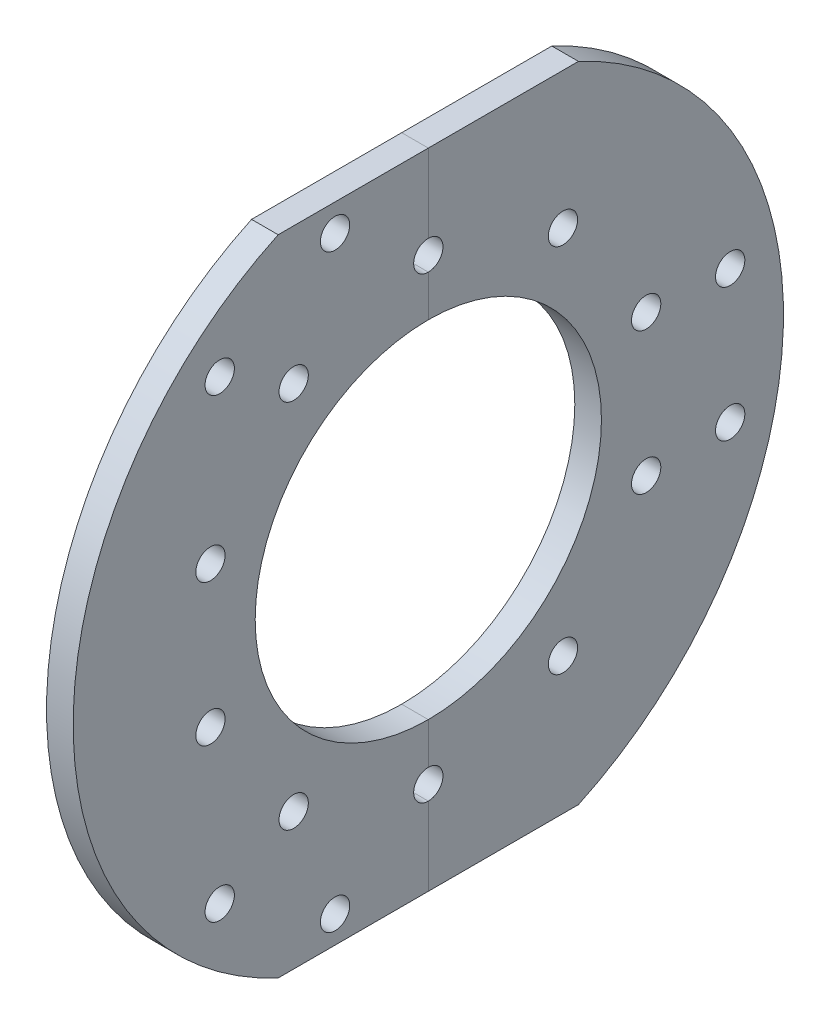
ISO-10303-21;
HEADER;
FILE_DESCRIPTION(('STEP AP214'),'2;1');
FILE_NAME('part.step','',(''),(''),'','','');
FILE_SCHEMA(('AUTOMOTIVE_DESIGN { 1 0 10303 214 1 1 1 1 }'));
ENDSEC;
DATA;
#1=APPLICATION_CONTEXT('core data for automotive mechanical design processes');
#2=APPLICATION_PROTOCOL_DEFINITION('international standard','automotive_design',2000,#1);
#3=PRODUCT_CONTEXT('',#1,'mechanical');
#4=PRODUCT('Part','Part','',(#3));
#5=PRODUCT_RELATED_PRODUCT_CATEGORY('part','',(#4));
#6=PRODUCT_DEFINITION_FORMATION('','',#4);
#7=PRODUCT_DEFINITION_CONTEXT('part definition',#1,'design');
#8=PRODUCT_DEFINITION('design','',#6,#7);
#9=PRODUCT_DEFINITION_SHAPE('','',#8);
#10=(LENGTH_UNIT() NAMED_UNIT(*) SI_UNIT(.MILLI.,.METRE.));
#11=(NAMED_UNIT(*) PLANE_ANGLE_UNIT() SI_UNIT($,.RADIAN.));
#12=(NAMED_UNIT(*) SI_UNIT($,.STERADIAN.) SOLID_ANGLE_UNIT());
#13=UNCERTAINTY_MEASURE_WITH_UNIT(LENGTH_MEASURE(1.E-05),#10,'distance_accuracy_value','');
#14=(GEOMETRIC_REPRESENTATION_CONTEXT(3) GLOBAL_UNCERTAINTY_ASSIGNED_CONTEXT((#13)) GLOBAL_UNIT_ASSIGNED_CONTEXT((#10,
#11,#12)) REPRESENTATION_CONTEXT('',''));
#15=CARTESIAN_POINT('',(0.,0.,0.));
#16=DIRECTION('',(0.,0.,1.));
#17=DIRECTION('',(1.,0.,0.));
#18=AXIS2_PLACEMENT_3D('',#15,#16,#17);
#19=CARTESIAN_POINT('',(0.,0.,0.));
#20=DIRECTION('',(0.,0.,1.));
#21=DIRECTION('',(1.,0.,0.));
#22=AXIS2_PLACEMENT_3D('',#19,#20,#21);
#23=PLANE('',#22);
#24=DIRECTION('',(0.,-1.,0.));
#25=VECTOR('',#24,1.);
#26=CARTESIAN_POINT('',(6.,0.,0.));
#27=LINE('',#26,#25);
#28=CARTESIAN_POINT('',(6.,72.5,0.));
#29=VERTEX_POINT('',#28);
#30=CARTESIAN_POINT('',(6.,54.9,0.));
#31=VERTEX_POINT('',#30);
#32=EDGE_CURVE('E94',#29,#31,#27,.T.);
#33=ORIENTED_EDGE('',*,*,#32,.F.);
#34=DIRECTION('',(1.,0.,0.));
#35=VECTOR('',#34,1.);
#36=CARTESIAN_POINT('',(6.,72.5,0.));
#37=LINE('',#36,#35);
#38=CARTESIAN_POINT('',(0.,72.5,0.));
#39=VERTEX_POINT('',#38);
#40=EDGE_CURVE('E160',#39,#29,#37,.T.);
#41=ORIENTED_EDGE('',*,*,#40,.F.);
#42=DIRECTION('',(0.,-1.,0.));
#43=VECTOR('',#42,1.);
#44=CARTESIAN_POINT('',(0.,0.,0.));
#45=LINE('',#44,#43);
#46=CARTESIAN_POINT('',(0.,54.9,0.));
#47=VERTEX_POINT('',#46);
#48=EDGE_CURVE('E144',#39,#47,#45,.T.);
#49=ORIENTED_EDGE('',*,*,#48,.T.);
#50=DIRECTION('',(-1.,0.,0.));
#51=VECTOR('',#50,1.);
#52=CARTESIAN_POINT('',(6.,54.9,0.));
#53=LINE('',#52,#51);
#54=EDGE_CURVE('E152',#31,#47,#53,.T.);
#55=ORIENTED_EDGE('',*,*,#54,.F.);
#56=EDGE_LOOP('',(#33,#41,#49,#55));
#57=FACE_BOUND('',#56,.T.);
#58=ADVANCED_FACE('F55',(#57),#23,.T.);
#59=CARTESIAN_POINT('',(6.,48.3,0.));
#60=VERTEX_POINT('',#59);
#61=CARTESIAN_POINT('',(6.,39.,0.));
#62=VERTEX_POINT('',#61);
#63=EDGE_CURVE('E226',#60,#62,#27,.T.);
#64=ORIENTED_EDGE('',*,*,#63,.F.);
#65=DIRECTION('',(-1.,0.,0.));
#66=VECTOR('',#65,1.);
#67=CARTESIAN_POINT('',(6.,48.3,0.));
#68=LINE('',#67,#66);
#69=CARTESIAN_POINT('',(0.,48.3,0.));
#70=VERTEX_POINT('',#69);
#71=EDGE_CURVE('E156',#70,#60,#68,.F.);
#72=ORIENTED_EDGE('',*,*,#71,.F.);
#73=CARTESIAN_POINT('',(0.,39.,0.));
#74=VERTEX_POINT('',#73);
#75=EDGE_CURVE('E146',#70,#74,#45,.T.);
#76=ORIENTED_EDGE('',*,*,#75,.T.);
#77=DIRECTION('',(-1.,0.,0.));
#78=VECTOR('',#77,1.);
#79=CARTESIAN_POINT('',(6.,39.,0.));
#80=LINE('',#79,#78);
#81=EDGE_CURVE('E194',#62,#74,#80,.T.);
#82=ORIENTED_EDGE('',*,*,#81,.F.);
#83=EDGE_LOOP('',(#64,#72,#76,#82));
#84=FACE_BOUND('',#83,.T.);
#85=ADVANCED_FACE('F342',(#84),#23,.T.);
#86=CARTESIAN_POINT('',(6.,-39.,0.));
#87=VERTEX_POINT('',#86);
#88=CARTESIAN_POINT('',(6.,-48.3,0.));
#89=VERTEX_POINT('',#88);
#90=EDGE_CURVE('E340',#87,#89,#27,.T.);
#91=ORIENTED_EDGE('',*,*,#90,.F.);
#92=DIRECTION('',(-1.,0.,0.));
#93=VECTOR('',#92,1.);
#94=CARTESIAN_POINT('',(6.,-39.,0.));
#95=LINE('',#94,#93);
#96=CARTESIAN_POINT('',(0.,-39.,0.));
#97=VERTEX_POINT('',#96);
#98=EDGE_CURVE('E182',#97,#87,#95,.F.);
#99=ORIENTED_EDGE('',*,*,#98,.F.);
#100=CARTESIAN_POINT('',(0.,-48.3,0.));
#101=VERTEX_POINT('',#100);
#102=EDGE_CURVE('E166',#97,#101,#45,.T.);
#103=ORIENTED_EDGE('',*,*,#102,.T.);
#104=DIRECTION('',(-1.,0.,0.));
#105=VECTOR('',#104,1.);
#106=CARTESIAN_POINT('',(6.,-48.3,0.));
#107=LINE('',#106,#105);
#108=EDGE_CURVE('E179',#89,#101,#107,.T.);
#109=ORIENTED_EDGE('',*,*,#108,.F.);
#110=EDGE_LOOP('',(#91,#99,#103,#109));
#111=FACE_BOUND('',#110,.T.);
#112=ADVANCED_FACE('F177',(#111),#23,.T.);
#113=CARTESIAN_POINT('',(6.,-54.9,0.));
#114=VERTEX_POINT('',#113);
#115=CARTESIAN_POINT('',(6.,-72.5,0.));
#116=VERTEX_POINT('',#115);
#117=EDGE_CURVE('E227',#114,#116,#27,.T.);
#118=ORIENTED_EDGE('',*,*,#117,.F.);
#119=DIRECTION('',(-1.,0.,0.));
#120=VECTOR('',#119,1.);
#121=CARTESIAN_POINT('',(6.,-54.9,0.));
#122=LINE('',#121,#120);
#123=CARTESIAN_POINT('',(0.,-54.9,0.));
#124=VERTEX_POINT('',#123);
#125=EDGE_CURVE('E157',#124,#114,#122,.F.);
#126=ORIENTED_EDGE('',*,*,#125,.F.);
#127=CARTESIAN_POINT('',(0.,-72.5,0.));
#128=VERTEX_POINT('',#127);
#129=EDGE_CURVE('E163',#124,#128,#45,.T.);
#130=ORIENTED_EDGE('',*,*,#129,.T.);
#131=DIRECTION('',(1.,0.,0.));
#132=VECTOR('',#131,1.);
#133=CARTESIAN_POINT('',(6.,-72.5,0.));
#134=LINE('',#133,#132);
#135=EDGE_CURVE('E161',#128,#116,#134,.T.);
#136=ORIENTED_EDGE('',*,*,#135,.T.);
#137=EDGE_LOOP('',(#118,#126,#130,#136));
#138=FACE_BOUND('',#137,.T.);
#139=ADVANCED_FACE('F314',(#138),#23,.T.);
#140=CARTESIAN_POINT('',(6.,-72.5,0.));
#141=DIRECTION('',(0.,1.,0.));
#142=DIRECTION('',(0.,0.,1.));
#143=AXIS2_PLACEMENT_3D('',#140,#141,#142);
#144=PLANE('',#143);
#145=ORIENTED_EDGE('',*,*,#135,.F.);
#146=DIRECTION('',(0.,0.,-1.));
#147=VECTOR('',#146,1.);
#148=CARTESIAN_POINT('',(0.,-72.5,0.));
#149=LINE('',#148,#147);
#150=CARTESIAN_POINT('',(0.,-72.5,-33.8193731461717));
#151=VERTEX_POINT('',#150);
#152=EDGE_CURVE('E74',#128,#151,#149,.T.);
#153=ORIENTED_EDGE('',*,*,#152,.T.);
#154=DIRECTION('',(-1.,0.,0.));
#155=VECTOR('',#154,1.);
#156=CARTESIAN_POINT('',(6.,-72.5,-33.8193731461717));
#157=LINE('',#156,#155);
#158=CARTESIAN_POINT('',(6.,-72.5,-33.8193731461717));
#159=VERTEX_POINT('',#158);
#160=EDGE_CURVE('E209',#159,#151,#157,.T.);
#161=ORIENTED_EDGE('',*,*,#160,.F.);
#162=DIRECTION('',(0.,0.,-1.));
#163=VECTOR('',#162,1.);
#164=CARTESIAN_POINT('',(6.,-72.5,0.));
#165=LINE('',#164,#163);
#166=EDGE_CURVE('E208',#116,#159,#165,.T.);
#167=ORIENTED_EDGE('',*,*,#166,.F.);
#168=EDGE_LOOP('',(#145,#153,#161,#167));
#169=FACE_BOUND('',#168,.T.);
#170=ADVANCED_FACE('F312',(#169),#144,.F.);
#171=CARTESIAN_POINT('',(6.,72.5,0.));
#172=DIRECTION('',(0.,1.,0.));
#173=DIRECTION('',(0.,0.,1.));
#174=AXIS2_PLACEMENT_3D('',#171,#172,#173);
#175=PLANE('',#174);
#176=DIRECTION('',(0.,0.,-1.));
#177=VECTOR('',#176,1.);
#178=CARTESIAN_POINT('',(0.,72.5,0.));
#179=LINE('',#178,#177);
#180=CARTESIAN_POINT('',(0.,72.5,-33.8193731461717));
#181=VERTEX_POINT('',#180);
#182=EDGE_CURVE('E199',#39,#181,#179,.T.);
#183=ORIENTED_EDGE('',*,*,#182,.F.);
#184=ORIENTED_EDGE('',*,*,#40,.T.);
#185=DIRECTION('',(0.,0.,-1.));
#186=VECTOR('',#185,1.);
#187=CARTESIAN_POINT('',(6.,72.5,0.));
#188=LINE('',#187,#186);
#189=CARTESIAN_POINT('',(6.,72.5,-33.8193731461717));
#190=VERTEX_POINT('',#189);
#191=EDGE_CURVE('E86',#29,#190,#188,.T.);
#192=ORIENTED_EDGE('',*,*,#191,.T.);
#193=DIRECTION('',(-1.,0.,0.));
#194=VECTOR('',#193,1.);
#195=CARTESIAN_POINT('',(6.,72.5,-33.8193731461717));
#196=LINE('',#195,#194);
#197=EDGE_CURVE('E204',#190,#181,#196,.T.);
#198=ORIENTED_EDGE('',*,*,#197,.T.);
#199=EDGE_LOOP('',(#183,#184,#192,#198));
#200=FACE_BOUND('',#199,.T.);
#201=ADVANCED_FACE('F198',(#200),#175,.T.);
#202=CARTESIAN_POINT('',(6.,0.,0.));
#203=DIRECTION('',(-1.,0.,0.));
#204=DIRECTION('',(0.,0.,1.));
#205=AXIS2_PLACEMENT_3D('',#202,#203,#204);
#206=CYLINDRICAL_SURFACE('',#205,39.);
#207=CARTESIAN_POINT('',(6.,0.,0.));
#208=DIRECTION('',(1.,0.,0.));
#209=DIRECTION('',(0.,0.,-1.));
#210=AXIS2_PLACEMENT_3D('',#207,#208,#209);
#211=CIRCLE('',#210,39.);
#212=EDGE_CURVE('E242',#87,#62,#211,.T.);
#213=ORIENTED_EDGE('',*,*,#212,.T.);
#214=ORIENTED_EDGE('',*,*,#81,.T.);
#215=CARTESIAN_POINT('',(0.,0.,0.));
#216=DIRECTION('',(1.,0.,0.));
#217=DIRECTION('',(0.,0.,-1.));
#218=AXIS2_PLACEMENT_3D('',#215,#216,#217);
#219=CIRCLE('',#218,39.);
#220=EDGE_CURVE('E183',#97,#74,#219,.T.);
#221=ORIENTED_EDGE('',*,*,#220,.F.);
#222=ORIENTED_EDGE('',*,*,#98,.T.);
#223=EDGE_LOOP('',(#213,#214,#221,#222));
#224=FACE_BOUND('',#223,.T.);
#225=ADVANCED_FACE('F320',(#224),#206,.F.);
#226=CARTESIAN_POINT('',(6.,-51.6,0.));
#227=DIRECTION('',(-1.,0.,0.));
#228=DIRECTION('',(0.,0.,1.));
#229=AXIS2_PLACEMENT_3D('',#226,#227,#228);
#230=CYLINDRICAL_SURFACE('',#229,3.29999999999999);
#231=CARTESIAN_POINT('',(6.,-51.6,0.));
#232=DIRECTION('',(1.,0.,0.));
#233=DIRECTION('',(0.,0.,-1.));
#234=AXIS2_PLACEMENT_3D('',#231,#232,#233);
#235=CIRCLE('',#234,3.29999999999999);
#236=EDGE_CURVE('E191',#114,#89,#235,.T.);
#237=ORIENTED_EDGE('',*,*,#236,.T.);
#238=ORIENTED_EDGE('',*,*,#108,.T.);
#239=CARTESIAN_POINT('',(0.,-51.6,0.));
#240=DIRECTION('',(1.,0.,0.));
#241=DIRECTION('',(0.,0.,-1.));
#242=AXIS2_PLACEMENT_3D('',#239,#240,#241);
#243=CIRCLE('',#242,3.29999999999999);
#244=EDGE_CURVE('E185',#124,#101,#243,.T.);
#245=ORIENTED_EDGE('',*,*,#244,.F.);
#246=ORIENTED_EDGE('',*,*,#125,.T.);
#247=EDGE_LOOP('',(#237,#238,#245,#246));
#248=FACE_BOUND('',#247,.T.);
#249=ADVANCED_FACE('F189',(#248),#230,.F.);
#250=CARTESIAN_POINT('',(6.,51.6,0.));
#251=DIRECTION('',(-1.,0.,0.));
#252=DIRECTION('',(0.,0.,1.));
#253=AXIS2_PLACEMENT_3D('',#250,#251,#252);
#254=CYLINDRICAL_SURFACE('',#253,3.3);
#255=CARTESIAN_POINT('',(6.,51.6,0.));
#256=DIRECTION('',(1.,0.,0.));
#257=DIRECTION('',(0.,0.,-1.));
#258=AXIS2_PLACEMENT_3D('',#255,#256,#257);
#259=CIRCLE('',#258,3.3);
#260=EDGE_CURVE('E154',#60,#31,#259,.T.);
#261=ORIENTED_EDGE('',*,*,#260,.T.);
#262=ORIENTED_EDGE('',*,*,#54,.T.);
#263=CARTESIAN_POINT('',(0.,51.6,0.));
#264=DIRECTION('',(1.,0.,0.));
#265=DIRECTION('',(0.,0.,-1.));
#266=AXIS2_PLACEMENT_3D('',#263,#264,#265);
#267=CIRCLE('',#266,3.3);
#268=EDGE_CURVE('E59',#70,#47,#267,.T.);
#269=ORIENTED_EDGE('',*,*,#268,.F.);
#270=ORIENTED_EDGE('',*,*,#71,.T.);
#271=EDGE_LOOP('',(#261,#262,#269,#270));
#272=FACE_BOUND('',#271,.T.);
#273=ADVANCED_FACE('F153',(#272),#254,.F.);
#274=CARTESIAN_POINT('',(6.,0.,0.));
#275=DIRECTION('',(1.,0.,0.));
#276=DIRECTION('',(0.,0.,-1.));
#277=AXIS2_PLACEMENT_3D('',#274,#275,#276);
#278=PLANE('',#277);
#279=CARTESIAN_POINT('',(6.,-41.7452769097473,-30.3297190182916));
#280=DIRECTION('',(1.,0.,0.));
#281=DIRECTION('',(0.,0.,-1.));
#282=AXIS2_PLACEMENT_3D('',#279,#280,#281);
#283=CIRCLE('',#282,3.3);
#284=CARTESIAN_POINT('',(6.,-41.7452769097473,-33.6297190182916));
#285=VERTEX_POINT('',#284);
#286=EDGE_CURVE('E241',#285,#285,#283,.T.);
#287=ORIENTED_EDGE('',*,*,#286,.F.);
#288=EDGE_LOOP('',(#287));
#289=FACE_BOUND('',#288,.T.);
#290=CARTESIAN_POINT('',(6.,-15.9452769097473,-49.0745162408299));
#291=DIRECTION('',(1.,0.,0.));
#292=DIRECTION('',(0.,0.,-1.));
#293=AXIS2_PLACEMENT_3D('',#290,#291,#292);
#294=CIRCLE('',#293,3.3);
#295=CARTESIAN_POINT('',(6.,-15.9452769097473,-52.3745162408299));
#296=VERTEX_POINT('',#295);
#297=EDGE_CURVE('E275',#296,#296,#294,.T.);
#298=ORIENTED_EDGE('',*,*,#297,.F.);
#299=EDGE_LOOP('',(#298));
#300=FACE_BOUND('',#299,.T.);
#301=CARTESIAN_POINT('',(6.,15.9452769097473,-49.0745162408299));
#302=DIRECTION('',(1.,0.,0.));
#303=DIRECTION('',(0.,0.,-1.));
#304=AXIS2_PLACEMENT_3D('',#301,#302,#303);
#305=CIRCLE('',#304,3.3);
#306=CARTESIAN_POINT('',(6.,15.9452769097473,-52.3745162408299));
#307=VERTEX_POINT('',#306);
#308=EDGE_CURVE('E283',#307,#307,#305,.T.);
#309=ORIENTED_EDGE('',*,*,#308,.F.);
#310=EDGE_LOOP('',(#309));
#311=FACE_BOUND('',#310,.T.);
#312=CARTESIAN_POINT('',(6.,41.7452769097473,-30.3297190182916));
#313=DIRECTION('',(1.,0.,0.));
#314=DIRECTION('',(0.,0.,-1.));
#315=AXIS2_PLACEMENT_3D('',#312,#313,#314);
#316=CIRCLE('',#315,3.30000000000004);
#317=CARTESIAN_POINT('',(6.,41.7452769097473,-33.6297190182917));
#318=VERTEX_POINT('',#317);
#319=EDGE_CURVE('E248',#318,#318,#316,.T.);
#320=ORIENTED_EDGE('',*,*,#319,.F.);
#321=EDGE_LOOP('',(#320));
#322=FACE_BOUND('',#321,.T.);
#323=CARTESIAN_POINT('',(6.,15.,-68.));
#324=DIRECTION('',(1.,0.,0.));
#325=DIRECTION('',(0.,0.,-1.));
#326=AXIS2_PLACEMENT_3D('',#323,#324,#325);
#327=CIRCLE('',#326,3.30000000000001);
#328=CARTESIAN_POINT('',(6.,15.,-71.3));
#329=VERTEX_POINT('',#328);
#330=EDGE_CURVE('E247',#329,#329,#327,.T.);
#331=ORIENTED_EDGE('',*,*,#330,.F.);
#332=EDGE_LOOP('',(#331));
#333=FACE_BOUND('',#332,.T.);
#334=CARTESIAN_POINT('',(6.,-15.,-68.));
#335=DIRECTION('',(1.,0.,0.));
#336=DIRECTION('',(0.,0.,-1.));
#337=AXIS2_PLACEMENT_3D('',#334,#335,#336);
#338=CIRCLE('',#337,3.3);
#339=CARTESIAN_POINT('',(6.,-15.,-71.3));
#340=VERTEX_POINT('',#339);
#341=EDGE_CURVE('E228',#340,#340,#338,.T.);
#342=ORIENTED_EDGE('',*,*,#341,.F.);
#343=EDGE_LOOP('',(#342));
#344=FACE_BOUND('',#343,.T.);
#345=ORIENTED_EDGE('',*,*,#191,.F.);
#346=ORIENTED_EDGE('',*,*,#32,.T.);
#347=ORIENTED_EDGE('',*,*,#260,.F.);
#348=ORIENTED_EDGE('',*,*,#63,.T.);
#349=ORIENTED_EDGE('',*,*,#212,.F.);
#350=ORIENTED_EDGE('',*,*,#90,.T.);
#351=ORIENTED_EDGE('',*,*,#236,.F.);
#352=ORIENTED_EDGE('',*,*,#117,.T.);
#353=ORIENTED_EDGE('',*,*,#166,.T.);
#354=CARTESIAN_POINT('',(6.,0.,0.));
#355=DIRECTION('',(1.,0.,0.));
#356=DIRECTION('',(0.,0.,-1.));
#357=AXIS2_PLACEMENT_3D('',#354,#355,#356);
#358=CIRCLE('',#357,80.);
#359=EDGE_CURVE('E201',#159,#190,#358,.T.);
#360=ORIENTED_EDGE('',*,*,#359,.T.);
#361=EDGE_LOOP('',(#345,#346,#347,#348,#349,#350,#351,#352,#353,#360));
#362=FACE_BOUND('',#361,.T.);
#363=ADVANCED_FACE('F57',(#289,#300,#311,#322,#333,#344,#362),#278,.T.);
#364=CARTESIAN_POINT('',(0.,0.,0.));
#365=DIRECTION('',(1.,0.,0.));
#366=DIRECTION('',(0.,0.,-1.));
#367=AXIS2_PLACEMENT_3D('',#364,#365,#366);
#368=PLANE('',#367);
#369=CARTESIAN_POINT('',(0.,-41.7452769097473,-30.3297190182916));
#370=DIRECTION('',(1.,0.,0.));
#371=DIRECTION('',(0.,0.,-1.));
#372=AXIS2_PLACEMENT_3D('',#369,#370,#371);
#373=CIRCLE('',#372,3.3);
#374=CARTESIAN_POINT('',(0.,-41.7452769097473,-33.6297190182916));
#375=VERTEX_POINT('',#374);
#376=EDGE_CURVE('E188',#375,#375,#373,.T.);
#377=ORIENTED_EDGE('',*,*,#376,.T.);
#378=EDGE_LOOP('',(#377));
#379=FACE_BOUND('',#378,.T.);
#380=CARTESIAN_POINT('',(0.,-15.9452769097473,-49.0745162408299));
#381=DIRECTION('',(1.,0.,0.));
#382=DIRECTION('',(0.,0.,-1.));
#383=AXIS2_PLACEMENT_3D('',#380,#381,#382);
#384=CIRCLE('',#383,3.3);
#385=CARTESIAN_POINT('',(0.,-15.9452769097473,-52.3745162408299));
#386=VERTEX_POINT('',#385);
#387=EDGE_CURVE('E260',#386,#386,#384,.T.);
#388=ORIENTED_EDGE('',*,*,#387,.T.);
#389=EDGE_LOOP('',(#388));
#390=FACE_BOUND('',#389,.T.);
#391=CARTESIAN_POINT('',(0.,15.9452769097473,-49.0745162408299));
#392=DIRECTION('',(1.,0.,0.));
#393=DIRECTION('',(0.,0.,-1.));
#394=AXIS2_PLACEMENT_3D('',#391,#392,#393);
#395=CIRCLE('',#394,3.3);
#396=CARTESIAN_POINT('',(0.,15.9452769097473,-52.3745162408299));
#397=VERTEX_POINT('',#396);
#398=EDGE_CURVE('E263',#397,#397,#395,.T.);
#399=ORIENTED_EDGE('',*,*,#398,.T.);
#400=EDGE_LOOP('',(#399));
#401=FACE_BOUND('',#400,.T.);
#402=CARTESIAN_POINT('',(0.,41.7452769097473,-30.3297190182916));
#403=DIRECTION('',(1.,0.,0.));
#404=DIRECTION('',(0.,0.,-1.));
#405=AXIS2_PLACEMENT_3D('',#402,#403,#404);
#406=CIRCLE('',#405,3.30000000000004);
#407=CARTESIAN_POINT('',(0.,41.7452769097473,-33.6297190182917));
#408=VERTEX_POINT('',#407);
#409=EDGE_CURVE('E150',#408,#408,#406,.T.);
#410=ORIENTED_EDGE('',*,*,#409,.T.);
#411=EDGE_LOOP('',(#410));
#412=FACE_BOUND('',#411,.T.);
#413=CARTESIAN_POINT('',(0.,15.,-68.));
#414=DIRECTION('',(1.,0.,0.));
#415=DIRECTION('',(0.,0.,-1.));
#416=AXIS2_PLACEMENT_3D('',#413,#414,#415);
#417=CIRCLE('',#416,3.30000000000001);
#418=CARTESIAN_POINT('',(0.,15.,-71.3));
#419=VERTEX_POINT('',#418);
#420=EDGE_CURVE('E65',#419,#419,#417,.T.);
#421=ORIENTED_EDGE('',*,*,#420,.T.);
#422=EDGE_LOOP('',(#421));
#423=FACE_BOUND('',#422,.T.);
#424=CARTESIAN_POINT('',(0.,-15.,-68.));
#425=DIRECTION('',(1.,0.,0.));
#426=DIRECTION('',(0.,0.,-1.));
#427=AXIS2_PLACEMENT_3D('',#424,#425,#426);
#428=CIRCLE('',#427,3.3);
#429=CARTESIAN_POINT('',(0.,-15.,-71.3));
#430=VERTEX_POINT('',#429);
#431=EDGE_CURVE('E13',#430,#430,#428,.T.);
#432=ORIENTED_EDGE('',*,*,#431,.T.);
#433=EDGE_LOOP('',(#432));
#434=FACE_BOUND('',#433,.T.);
#435=ORIENTED_EDGE('',*,*,#48,.F.);
#436=ORIENTED_EDGE('',*,*,#182,.T.);
#437=CARTESIAN_POINT('',(0.,0.,0.));
#438=DIRECTION('',(1.,0.,0.));
#439=DIRECTION('',(0.,0.,-1.));
#440=AXIS2_PLACEMENT_3D('',#437,#438,#439);
#441=CIRCLE('',#440,80.);
#442=EDGE_CURVE('E250',#151,#181,#441,.T.);
#443=ORIENTED_EDGE('',*,*,#442,.F.);
#444=ORIENTED_EDGE('',*,*,#152,.F.);
#445=ORIENTED_EDGE('',*,*,#129,.F.);
#446=ORIENTED_EDGE('',*,*,#244,.T.);
#447=ORIENTED_EDGE('',*,*,#102,.F.);
#448=ORIENTED_EDGE('',*,*,#220,.T.);
#449=ORIENTED_EDGE('',*,*,#75,.F.);
#450=ORIENTED_EDGE('',*,*,#268,.T.);
#451=EDGE_LOOP('',(#435,#436,#443,#444,#445,#446,#447,#448,#449,#450));
#452=FACE_BOUND('',#451,.T.);
#453=ADVANCED_FACE('F142',(#379,#390,#401,#412,#423,#434,#452),#368,.F.);
#454=CARTESIAN_POINT('',(6.,0.,0.));
#455=DIRECTION('',(-1.,0.,0.));
#456=DIRECTION('',(0.,0.,1.));
#457=AXIS2_PLACEMENT_3D('',#454,#455,#456);
#458=CYLINDRICAL_SURFACE('',#457,80.);
#459=ORIENTED_EDGE('',*,*,#442,.T.);
#460=ORIENTED_EDGE('',*,*,#197,.F.);
#461=ORIENTED_EDGE('',*,*,#359,.F.);
#462=ORIENTED_EDGE('',*,*,#160,.T.);
#463=EDGE_LOOP('',(#459,#460,#461,#462));
#464=FACE_BOUND('',#463,.T.);
#465=ADVANCED_FACE('F307',(#464),#458,.T.);
#466=CARTESIAN_POINT('',(6.,-41.7452769097473,-30.3297190182916));
#467=DIRECTION('',(-1.,0.,0.));
#468=DIRECTION('',(0.,0.,1.));
#469=AXIS2_PLACEMENT_3D('',#466,#467,#468);
#470=CYLINDRICAL_SURFACE('',#469,3.3);
#471=ORIENTED_EDGE('',*,*,#286,.T.);
#472=EDGE_LOOP('',(#471));
#473=FACE_BOUND('',#472,.T.);
#474=ORIENTED_EDGE('',*,*,#376,.F.);
#475=EDGE_LOOP('',(#474));
#476=FACE_BOUND('',#475,.T.);
#477=ADVANCED_FACE('F412',(#473,#476),#470,.F.);
#478=CARTESIAN_POINT('',(6.,-15.9452769097473,-49.0745162408299));
#479=DIRECTION('',(-1.,0.,0.));
#480=DIRECTION('',(0.,0.,1.));
#481=AXIS2_PLACEMENT_3D('',#478,#479,#480);
#482=CYLINDRICAL_SURFACE('',#481,3.3);
#483=ORIENTED_EDGE('',*,*,#297,.T.);
#484=EDGE_LOOP('',(#483));
#485=FACE_BOUND('',#484,.T.);
#486=ORIENTED_EDGE('',*,*,#387,.F.);
#487=EDGE_LOOP('',(#486));
#488=FACE_BOUND('',#487,.T.);
#489=ADVANCED_FACE('F420',(#485,#488),#482,.F.);
#490=CARTESIAN_POINT('',(6.,15.9452769097473,-49.0745162408299));
#491=DIRECTION('',(-1.,0.,0.));
#492=DIRECTION('',(0.,0.,1.));
#493=AXIS2_PLACEMENT_3D('',#490,#491,#492);
#494=CYLINDRICAL_SURFACE('',#493,3.3);
#495=ORIENTED_EDGE('',*,*,#308,.T.);
#496=EDGE_LOOP('',(#495));
#497=FACE_BOUND('',#496,.T.);
#498=ORIENTED_EDGE('',*,*,#398,.F.);
#499=EDGE_LOOP('',(#498));
#500=FACE_BOUND('',#499,.T.);
#501=ADVANCED_FACE('F430',(#497,#500),#494,.F.);
#502=CARTESIAN_POINT('',(6.,41.7452769097473,-30.3297190182916));
#503=DIRECTION('',(-1.,0.,0.));
#504=DIRECTION('',(0.,0.,1.));
#505=AXIS2_PLACEMENT_3D('',#502,#503,#504);
#506=CYLINDRICAL_SURFACE('',#505,3.30000000000004);
#507=ORIENTED_EDGE('',*,*,#319,.T.);
#508=EDGE_LOOP('',(#507));
#509=FACE_BOUND('',#508,.T.);
#510=ORIENTED_EDGE('',*,*,#409,.F.);
#511=EDGE_LOOP('',(#510));
#512=FACE_BOUND('',#511,.T.);
#513=ADVANCED_FACE('F440',(#509,#512),#506,.F.);
#514=CARTESIAN_POINT('',(6.,15.,-68.));
#515=DIRECTION('',(-1.,0.,0.));
#516=DIRECTION('',(0.,0.,1.));
#517=AXIS2_PLACEMENT_3D('',#514,#515,#516);
#518=CYLINDRICAL_SURFACE('',#517,3.30000000000001);
#519=ORIENTED_EDGE('',*,*,#330,.T.);
#520=EDGE_LOOP('',(#519));
#521=FACE_BOUND('',#520,.T.);
#522=ORIENTED_EDGE('',*,*,#420,.F.);
#523=EDGE_LOOP('',(#522));
#524=FACE_BOUND('',#523,.T.);
#525=ADVANCED_FACE('F450',(#521,#524),#518,.F.);
#526=CARTESIAN_POINT('',(6.,-15.,-68.));
#527=DIRECTION('',(-1.,0.,0.));
#528=DIRECTION('',(0.,0.,1.));
#529=AXIS2_PLACEMENT_3D('',#526,#527,#528);
#530=CYLINDRICAL_SURFACE('',#529,3.3);
#531=ORIENTED_EDGE('',*,*,#341,.T.);
#532=EDGE_LOOP('',(#531));
#533=FACE_BOUND('',#532,.T.);
#534=ORIENTED_EDGE('',*,*,#431,.F.);
#535=EDGE_LOOP('',(#534));
#536=FACE_BOUND('',#535,.T.);
#537=ADVANCED_FACE('F298',(#533,#536),#530,.F.);
#538=CLOSED_SHELL('',(#58,#85,#112,#139,#170,#201,#225,#249,#273,#363,#453,#465,#477,#489,#501,
#513,#525,#537));
#539=MANIFOLD_SOLID_BREP('B2',#538);
#540=CARTESIAN_POINT('',(0.,0.,0.));
#541=DIRECTION('',(0.,0.,1.));
#542=DIRECTION('',(1.,0.,0.));
#543=AXIS2_PLACEMENT_3D('',#540,#541,#542);
#544=PLANE('',#543);
#545=DIRECTION('',(0.,-1.,0.));
#546=VECTOR('',#545,1.);
#547=CARTESIAN_POINT('',(6.,0.,0.));
#548=LINE('',#547,#546);
#549=CARTESIAN_POINT('',(6.,72.5,0.));
#550=VERTEX_POINT('',#549);
#551=CARTESIAN_POINT('',(6.,54.9,0.));
#552=VERTEX_POINT('',#551);
#553=EDGE_CURVE('E511',#550,#552,#548,.T.);
#554=ORIENTED_EDGE('',*,*,#553,.T.);
#555=DIRECTION('',(-1.,0.,0.));
#556=VECTOR('',#555,1.);
#557=CARTESIAN_POINT('',(6.,54.9,0.));
#558=LINE('',#557,#556);
#559=CARTESIAN_POINT('',(0.,54.9,0.));
#560=VERTEX_POINT('',#559);
#561=EDGE_CURVE('E518',#552,#560,#558,.T.);
#562=ORIENTED_EDGE('',*,*,#561,.T.);
#563=DIRECTION('',(0.,-1.,0.));
#564=VECTOR('',#563,1.);
#565=CARTESIAN_POINT('',(0.,0.,0.));
#566=LINE('',#565,#564);
#567=CARTESIAN_POINT('',(0.,72.5,0.));
#568=VERTEX_POINT('',#567);
#569=EDGE_CURVE('E742',#568,#560,#566,.T.);
#570=ORIENTED_EDGE('',*,*,#569,.F.);
#571=DIRECTION('',(1.,0.,0.));
#572=VECTOR('',#571,1.);
#573=CARTESIAN_POINT('',(6.,72.5,0.));
#574=LINE('',#573,#572);
#575=EDGE_CURVE('E503',#568,#550,#574,.T.);
#576=ORIENTED_EDGE('',*,*,#575,.T.);
#577=EDGE_LOOP('',(#554,#562,#570,#576));
#578=FACE_BOUND('',#577,.T.);
#579=ADVANCED_FACE('F499',(#578),#544,.F.);
#580=CARTESIAN_POINT('',(6.,48.3,0.));
#581=VERTEX_POINT('',#580);
#582=CARTESIAN_POINT('',(6.,39.,0.));
#583=VERTEX_POINT('',#582);
#584=EDGE_CURVE('E758',#581,#583,#548,.T.);
#585=ORIENTED_EDGE('',*,*,#584,.T.);
#586=DIRECTION('',(-1.,0.,0.));
#587=VECTOR('',#586,1.);
#588=CARTESIAN_POINT('',(6.,39.,0.));
#589=LINE('',#588,#587);
#590=CARTESIAN_POINT('',(0.,39.,0.));
#591=VERTEX_POINT('',#590);
#592=EDGE_CURVE('E753',#583,#591,#589,.T.);
#593=ORIENTED_EDGE('',*,*,#592,.T.);
#594=CARTESIAN_POINT('',(0.,48.3,0.));
#595=VERTEX_POINT('',#594);
#596=EDGE_CURVE('E810',#595,#591,#566,.T.);
#597=ORIENTED_EDGE('',*,*,#596,.F.);
#598=DIRECTION('',(-1.,0.,0.));
#599=VECTOR('',#598,1.);
#600=CARTESIAN_POINT('',(6.,48.3,0.));
#601=LINE('',#600,#599);
#602=EDGE_CURVE('E526',#595,#581,#601,.F.);
#603=ORIENTED_EDGE('',*,*,#602,.T.);
#604=EDGE_LOOP('',(#585,#593,#597,#603));
#605=FACE_BOUND('',#604,.T.);
#606=ADVANCED_FACE('F798',(#605),#544,.F.);
#607=CARTESIAN_POINT('',(6.,-39.,0.));
#608=VERTEX_POINT('',#607);
#609=CARTESIAN_POINT('',(6.,-48.3,0.));
#610=VERTEX_POINT('',#609);
#611=EDGE_CURVE('E509',#608,#610,#548,.T.);
#612=ORIENTED_EDGE('',*,*,#611,.T.);
#613=DIRECTION('',(-1.,0.,0.));
#614=VECTOR('',#613,1.);
#615=CARTESIAN_POINT('',(6.,-48.3,0.));
#616=LINE('',#615,#614);
#617=CARTESIAN_POINT('',(0.,-48.3,0.));
#618=VERTEX_POINT('',#617);
#619=EDGE_CURVE('E633',#610,#618,#616,.T.);
#620=ORIENTED_EDGE('',*,*,#619,.T.);
#621=CARTESIAN_POINT('',(0.,-39.,0.));
#622=VERTEX_POINT('',#621);
#623=EDGE_CURVE('E741',#622,#618,#566,.T.);
#624=ORIENTED_EDGE('',*,*,#623,.F.);
#625=DIRECTION('',(-1.,0.,0.));
#626=VECTOR('',#625,1.);
#627=CARTESIAN_POINT('',(6.,-39.,0.));
#628=LINE('',#627,#626);
#629=EDGE_CURVE('E748',#622,#608,#628,.F.);
#630=ORIENTED_EDGE('',*,*,#629,.T.);
#631=EDGE_LOOP('',(#612,#620,#624,#630));
#632=FACE_BOUND('',#631,.T.);
#633=ADVANCED_FACE('F764',(#632),#544,.F.);
#634=CARTESIAN_POINT('',(6.,-54.9,0.));
#635=VERTEX_POINT('',#634);
#636=CARTESIAN_POINT('',(6.,-72.5,0.));
#637=VERTEX_POINT('',#636);
#638=EDGE_CURVE('E53',#635,#637,#548,.T.);
#639=ORIENTED_EDGE('',*,*,#638,.T.);
#640=DIRECTION('',(1.,0.,0.));
#641=VECTOR('',#640,1.);
#642=CARTESIAN_POINT('',(6.,-72.5,0.));
#643=LINE('',#642,#641);
#644=CARTESIAN_POINT('',(0.,-72.5,0.));
#645=VERTEX_POINT('',#644);
#646=EDGE_CURVE('E631',#645,#637,#643,.T.);
#647=ORIENTED_EDGE('',*,*,#646,.F.);
#648=CARTESIAN_POINT('',(0.,-54.9,0.));
#649=VERTEX_POINT('',#648);
#650=EDGE_CURVE('E592',#649,#645,#566,.T.);
#651=ORIENTED_EDGE('',*,*,#650,.F.);
#652=DIRECTION('',(-1.,0.,0.));
#653=VECTOR('',#652,1.);
#654=CARTESIAN_POINT('',(6.,-54.9,0.));
#655=LINE('',#654,#653);
#656=EDGE_CURVE('E743',#649,#635,#655,.F.);
#657=ORIENTED_EDGE('',*,*,#656,.T.);
#658=EDGE_LOOP('',(#639,#647,#651,#657));
#659=FACE_BOUND('',#658,.T.);
#660=ADVANCED_FACE('F501',(#659),#544,.F.);
#661=CARTESIAN_POINT('',(6.,41.7452769097473,30.3297190182916));
#662=DIRECTION('',(-1.,0.,0.));
#663=DIRECTION('',(0.,0.,1.));
#664=AXIS2_PLACEMENT_3D('',#661,#662,#663);
#665=CYLINDRICAL_SURFACE('',#664,3.3);
#666=CARTESIAN_POINT('',(6.,41.7452769097473,30.3297190182916));
#667=DIRECTION('',(1.,0.,0.));
#668=DIRECTION('',(0.,0.,-1.));
#669=AXIS2_PLACEMENT_3D('',#666,#667,#668);
#670=CIRCLE('',#669,3.3);
#671=CARTESIAN_POINT('',(6.,41.7452769097473,27.0297190182916));
#672=VERTEX_POINT('',#671);
#673=EDGE_CURVE('E644',#672,#672,#670,.T.);
#674=ORIENTED_EDGE('',*,*,#673,.T.);
#675=EDGE_LOOP('',(#674));
#676=FACE_BOUND('',#675,.T.);
#677=CARTESIAN_POINT('',(0.,41.7452769097473,30.3297190182916));
#678=DIRECTION('',(1.,0.,0.));
#679=DIRECTION('',(0.,0.,-1.));
#680=AXIS2_PLACEMENT_3D('',#677,#678,#679);
#681=CIRCLE('',#680,3.3);
#682=CARTESIAN_POINT('',(0.,41.7452769097473,27.0297190182916));
#683=VERTEX_POINT('',#682);
#684=EDGE_CURVE('E723',#683,#683,#681,.T.);
#685=ORIENTED_EDGE('',*,*,#684,.F.);
#686=EDGE_LOOP('',(#685));
#687=FACE_BOUND('',#686,.T.);
#688=ADVANCED_FACE('F716',(#676,#687),#665,.F.);
#689=CARTESIAN_POINT('',(6.,15.9452769097473,49.0745162408299));
#690=DIRECTION('',(-1.,0.,0.));
#691=DIRECTION('',(0.,0.,1.));
#692=AXIS2_PLACEMENT_3D('',#689,#690,#691);
#693=CYLINDRICAL_SURFACE('',#692,3.3);
#694=CARTESIAN_POINT('',(6.,15.9452769097473,49.0745162408299));
#695=DIRECTION('',(1.,0.,0.));
#696=DIRECTION('',(0.,0.,-1.));
#697=AXIS2_PLACEMENT_3D('',#694,#695,#696);
#698=CIRCLE('',#697,3.3);
#699=CARTESIAN_POINT('',(6.,15.9452769097473,45.7745162408299));
#700=VERTEX_POINT('',#699);
#701=EDGE_CURVE('E649',#700,#700,#698,.T.);
#702=ORIENTED_EDGE('',*,*,#701,.T.);
#703=EDGE_LOOP('',(#702));
#704=FACE_BOUND('',#703,.T.);
#705=CARTESIAN_POINT('',(0.,15.9452769097473,49.0745162408299));
#706=DIRECTION('',(1.,0.,0.));
#707=DIRECTION('',(0.,0.,-1.));
#708=AXIS2_PLACEMENT_3D('',#705,#706,#707);
#709=CIRCLE('',#708,3.3);
#710=CARTESIAN_POINT('',(0.,15.9452769097473,45.7745162408299));
#711=VERTEX_POINT('',#710);
#712=EDGE_CURVE('E726',#711,#711,#709,.T.);
#713=ORIENTED_EDGE('',*,*,#712,.F.);
#714=EDGE_LOOP('',(#713));
#715=FACE_BOUND('',#714,.T.);
#716=ADVANCED_FACE('F719',(#704,#715),#693,.F.);
#717=CARTESIAN_POINT('',(6.,-15.9452769097473,49.0745162408299));
#718=DIRECTION('',(-1.,0.,0.));
#719=DIRECTION('',(0.,0.,1.));
#720=AXIS2_PLACEMENT_3D('',#717,#718,#719);
#721=CYLINDRICAL_SURFACE('',#720,3.3);
#722=CARTESIAN_POINT('',(6.,-15.9452769097473,49.0745162408299));
#723=DIRECTION('',(1.,0.,0.));
#724=DIRECTION('',(0.,0.,-1.));
#725=AXIS2_PLACEMENT_3D('',#722,#723,#724);
#726=CIRCLE('',#725,3.3);
#727=CARTESIAN_POINT('',(6.,-15.9452769097473,45.7745162408299));
#728=VERTEX_POINT('',#727);
#729=EDGE_CURVE('E654',#728,#728,#726,.T.);
#730=ORIENTED_EDGE('',*,*,#729,.T.);
#731=EDGE_LOOP('',(#730));
#732=FACE_BOUND('',#731,.T.);
#733=CARTESIAN_POINT('',(0.,-15.9452769097473,49.0745162408299));
#734=DIRECTION('',(1.,0.,0.));
#735=DIRECTION('',(0.,0.,-1.));
#736=AXIS2_PLACEMENT_3D('',#733,#734,#735);
#737=CIRCLE('',#736,3.3);
#738=CARTESIAN_POINT('',(0.,-15.9452769097473,45.7745162408299));
#739=VERTEX_POINT('',#738);
#740=EDGE_CURVE('E732',#739,#739,#737,.T.);
#741=ORIENTED_EDGE('',*,*,#740,.F.);
#742=EDGE_LOOP('',(#741));
#743=FACE_BOUND('',#742,.T.);
#744=ADVANCED_FACE('F784',(#732,#743),#721,.F.);
#745=CARTESIAN_POINT('',(6.,-41.7452769097473,30.3297190182916));
#746=DIRECTION('',(-1.,0.,0.));
#747=DIRECTION('',(0.,0.,1.));
#748=AXIS2_PLACEMENT_3D('',#745,#746,#747);
#749=CYLINDRICAL_SURFACE('',#748,3.30000000000001);
#750=CARTESIAN_POINT('',(6.,-41.7452769097473,30.3297190182916));
#751=DIRECTION('',(1.,0.,0.));
#752=DIRECTION('',(0.,0.,-1.));
#753=AXIS2_PLACEMENT_3D('',#750,#751,#752);
#754=CIRCLE('',#753,3.30000000000001);
#755=CARTESIAN_POINT('',(6.,-41.7452769097473,27.0297190182916));
#756=VERTEX_POINT('',#755);
#757=EDGE_CURVE('E662',#756,#756,#754,.T.);
#758=ORIENTED_EDGE('',*,*,#757,.T.);
#759=EDGE_LOOP('',(#758));
#760=FACE_BOUND('',#759,.T.);
#761=CARTESIAN_POINT('',(0.,-41.7452769097473,30.3297190182916));
#762=DIRECTION('',(1.,0.,0.));
#763=DIRECTION('',(0.,0.,-1.));
#764=AXIS2_PLACEMENT_3D('',#761,#762,#763);
#765=CIRCLE('',#764,3.30000000000001);
#766=CARTESIAN_POINT('',(0.,-41.7452769097473,27.0297190182916));
#767=VERTEX_POINT('',#766);
#768=EDGE_CURVE('E770',#767,#767,#765,.T.);
#769=ORIENTED_EDGE('',*,*,#768,.F.);
#770=EDGE_LOOP('',(#769));
#771=FACE_BOUND('',#770,.T.);
#772=ADVANCED_FACE('F786',(#760,#771),#749,.F.);
#773=CARTESIAN_POINT('',(6.,0.,0.));
#774=DIRECTION('',(-1.,0.,0.));
#775=DIRECTION('',(0.,0.,1.));
#776=AXIS2_PLACEMENT_3D('',#773,#774,#775);
#777=CYLINDRICAL_SURFACE('',#776,80.);
#778=CARTESIAN_POINT('',(0.,0.,0.));
#779=DIRECTION('',(1.,0.,0.));
#780=DIRECTION('',(0.,0.,-1.));
#781=AXIS2_PLACEMENT_3D('',#778,#779,#780);
#782=CIRCLE('',#781,80.);
#783=CARTESIAN_POINT('',(0.,72.5,33.8193731461717));
#784=VERTEX_POINT('',#783);
#785=CARTESIAN_POINT('',(0.,-72.5,33.8193731461717));
#786=VERTEX_POINT('',#785);
#787=EDGE_CURVE('E686',#784,#786,#782,.T.);
#788=ORIENTED_EDGE('',*,*,#787,.T.);
#789=DIRECTION('',(-1.,0.,0.));
#790=VECTOR('',#789,1.);
#791=CARTESIAN_POINT('',(6.,-72.5,33.8193731461717));
#792=LINE('',#791,#790);
#793=CARTESIAN_POINT('',(6.,-72.5,33.8193731461717));
#794=VERTEX_POINT('',#793);
#795=EDGE_CURVE('E593',#794,#786,#792,.T.);
#796=ORIENTED_EDGE('',*,*,#795,.F.);
#797=CARTESIAN_POINT('',(6.,0.,0.));
#798=DIRECTION('',(1.,0.,0.));
#799=DIRECTION('',(0.,0.,-1.));
#800=AXIS2_PLACEMENT_3D('',#797,#798,#799);
#801=CIRCLE('',#800,80.);
#802=CARTESIAN_POINT('',(6.,72.5,33.8193731461717));
#803=VERTEX_POINT('',#802);
#804=EDGE_CURVE('E596',#803,#794,#801,.T.);
#805=ORIENTED_EDGE('',*,*,#804,.F.);
#806=DIRECTION('',(-1.,0.,0.));
#807=VECTOR('',#806,1.);
#808=CARTESIAN_POINT('',(6.,72.5,33.8193731461717));
#809=LINE('',#808,#807);
#810=EDGE_CURVE('E583',#803,#784,#809,.T.);
#811=ORIENTED_EDGE('',*,*,#810,.T.);
#812=EDGE_LOOP('',(#788,#796,#805,#811));
#813=FACE_BOUND('',#812,.T.);
#814=ADVANCED_FACE('F597',(#813),#777,.T.);
#815=CARTESIAN_POINT('',(6.,-72.5,0.));
#816=DIRECTION('',(0.,1.,0.));
#817=DIRECTION('',(0.,0.,1.));
#818=AXIS2_PLACEMENT_3D('',#815,#816,#817);
#819=PLANE('',#818);
#820=DIRECTION('',(0.,0.,-1.));
#821=VECTOR('',#820,1.);
#822=CARTESIAN_POINT('',(0.,-72.5,0.));
#823=LINE('',#822,#821);
#824=EDGE_CURVE('E729',#786,#645,#823,.T.);
#825=ORIENTED_EDGE('',*,*,#824,.T.);
#826=ORIENTED_EDGE('',*,*,#646,.T.);
#827=DIRECTION('',(0.,0.,-1.));
#828=VECTOR('',#827,1.);
#829=CARTESIAN_POINT('',(6.,-72.5,0.));
#830=LINE('',#829,#828);
#831=EDGE_CURVE('E609',#794,#637,#830,.T.);
#832=ORIENTED_EDGE('',*,*,#831,.F.);
#833=ORIENTED_EDGE('',*,*,#795,.T.);
#834=EDGE_LOOP('',(#825,#826,#832,#833));
#835=FACE_BOUND('',#834,.T.);
#836=ADVANCED_FACE('F808',(#835),#819,.F.);
#837=CARTESIAN_POINT('',(6.,-51.6,0.));
#838=DIRECTION('',(-1.,0.,0.));
#839=DIRECTION('',(0.,0.,1.));
#840=AXIS2_PLACEMENT_3D('',#837,#838,#839);
#841=CYLINDRICAL_SURFACE('',#840,3.29999999999999);
#842=ORIENTED_EDGE('',*,*,#619,.F.);
#843=CARTESIAN_POINT('',(6.,-51.6,0.));
#844=DIRECTION('',(1.,0.,0.));
#845=DIRECTION('',(0.,0.,-1.));
#846=AXIS2_PLACEMENT_3D('',#843,#844,#845);
#847=CIRCLE('',#846,3.29999999999999);
#848=EDGE_CURVE('E666',#610,#635,#847,.T.);
#849=ORIENTED_EDGE('',*,*,#848,.T.);
#850=ORIENTED_EDGE('',*,*,#656,.F.);
#851=CARTESIAN_POINT('',(0.,-51.6,0.));
#852=DIRECTION('',(1.,0.,0.));
#853=DIRECTION('',(0.,0.,-1.));
#854=AXIS2_PLACEMENT_3D('',#851,#852,#853);
#855=CIRCLE('',#854,3.29999999999999);
#856=EDGE_CURVE('E768',#618,#649,#855,.T.);
#857=ORIENTED_EDGE('',*,*,#856,.F.);
#858=EDGE_LOOP('',(#842,#849,#850,#857));
#859=FACE_BOUND('',#858,.T.);
#860=ADVANCED_FACE('F766',(#859),#841,.F.);
#861=CARTESIAN_POINT('',(6.,0.,0.));
#862=DIRECTION('',(-1.,0.,0.));
#863=DIRECTION('',(0.,0.,1.));
#864=AXIS2_PLACEMENT_3D('',#861,#862,#863);
#865=CYLINDRICAL_SURFACE('',#864,39.);
#866=ORIENTED_EDGE('',*,*,#592,.F.);
#867=CARTESIAN_POINT('',(6.,0.,0.));
#868=DIRECTION('',(1.,0.,0.));
#869=DIRECTION('',(0.,0.,-1.));
#870=AXIS2_PLACEMENT_3D('',#867,#868,#869);
#871=CIRCLE('',#870,39.);
#872=EDGE_CURVE('E613',#583,#608,#871,.T.);
#873=ORIENTED_EDGE('',*,*,#872,.T.);
#874=ORIENTED_EDGE('',*,*,#629,.F.);
#875=CARTESIAN_POINT('',(0.,0.,0.));
#876=DIRECTION('',(1.,0.,0.));
#877=DIRECTION('',(0.,0.,-1.));
#878=AXIS2_PLACEMENT_3D('',#875,#876,#877);
#879=CIRCLE('',#878,39.);
#880=EDGE_CURVE('E725',#591,#622,#879,.T.);
#881=ORIENTED_EDGE('',*,*,#880,.F.);
#882=EDGE_LOOP('',(#866,#873,#874,#881));
#883=FACE_BOUND('',#882,.T.);
#884=ADVANCED_FACE('F815',(#883),#865,.F.);
#885=CARTESIAN_POINT('',(6.,51.6,0.));
#886=DIRECTION('',(-1.,0.,0.));
#887=DIRECTION('',(0.,0.,1.));
#888=AXIS2_PLACEMENT_3D('',#885,#886,#887);
#889=CYLINDRICAL_SURFACE('',#888,3.3);
#890=ORIENTED_EDGE('',*,*,#561,.F.);
#891=CARTESIAN_POINT('',(6.,51.6,0.));
#892=DIRECTION('',(1.,0.,0.));
#893=DIRECTION('',(0.,0.,-1.));
#894=AXIS2_PLACEMENT_3D('',#891,#892,#893);
#895=CIRCLE('',#894,3.3);
#896=EDGE_CURVE('E671',#552,#581,#895,.T.);
#897=ORIENTED_EDGE('',*,*,#896,.T.);
#898=ORIENTED_EDGE('',*,*,#602,.F.);
#899=CARTESIAN_POINT('',(0.,51.6,0.));
#900=DIRECTION('',(1.,0.,0.));
#901=DIRECTION('',(0.,0.,-1.));
#902=AXIS2_PLACEMENT_3D('',#899,#900,#901);
#903=CIRCLE('',#902,3.3);
#904=EDGE_CURVE('E771',#560,#595,#903,.T.);
#905=ORIENTED_EDGE('',*,*,#904,.F.);
#906=EDGE_LOOP('',(#890,#897,#898,#905));
#907=FACE_BOUND('',#906,.T.);
#908=ADVANCED_FACE('F816',(#907),#889,.F.);
#909=CARTESIAN_POINT('',(6.,72.5,0.));
#910=DIRECTION('',(0.,1.,0.));
#911=DIRECTION('',(0.,0.,1.));
#912=AXIS2_PLACEMENT_3D('',#909,#910,#911);
#913=PLANE('',#912);
#914=ORIENTED_EDGE('',*,*,#575,.F.);
#915=DIRECTION('',(0.,0.,-1.));
#916=VECTOR('',#915,1.);
#917=CARTESIAN_POINT('',(0.,72.5,0.));
#918=LINE('',#917,#916);
#919=EDGE_CURVE('E589',#784,#568,#918,.T.);
#920=ORIENTED_EDGE('',*,*,#919,.F.);
#921=ORIENTED_EDGE('',*,*,#810,.F.);
#922=DIRECTION('',(0.,0.,-1.));
#923=VECTOR('',#922,1.);
#924=CARTESIAN_POINT('',(6.,72.5,0.));
#925=LINE('',#924,#923);
#926=EDGE_CURVE('E587',#803,#550,#925,.T.);
#927=ORIENTED_EDGE('',*,*,#926,.T.);
#928=EDGE_LOOP('',(#914,#920,#921,#927));
#929=FACE_BOUND('',#928,.T.);
#930=ADVANCED_FACE('F585',(#929),#913,.T.);
#931=CARTESIAN_POINT('',(6.,-51.3897274573418,46.9903810567666));
#932=DIRECTION('',(-1.,0.,0.));
#933=DIRECTION('',(0.,0.,1.));
#934=AXIS2_PLACEMENT_3D('',#931,#932,#933);
#935=CYLINDRICAL_SURFACE('',#934,3.30000000000001);
#936=CARTESIAN_POINT('',(6.,-51.3897274573418,46.9903810567666));
#937=DIRECTION('',(1.,0.,0.));
#938=DIRECTION('',(0.,0.,-1.));
#939=AXIS2_PLACEMENT_3D('',#936,#937,#938);
#940=CIRCLE('',#939,3.30000000000001);
#941=CARTESIAN_POINT('',(6.,-51.3897274573418,43.6903810567666));
#942=VERTEX_POINT('',#941);
#943=EDGE_CURVE('E674',#942,#942,#940,.T.);
#944=ORIENTED_EDGE('',*,*,#943,.T.);
#945=EDGE_LOOP('',(#944));
#946=FACE_BOUND('',#945,.T.);
#947=CARTESIAN_POINT('',(0.,-51.3897274573418,46.9903810567666));
#948=DIRECTION('',(1.,0.,0.));
#949=DIRECTION('',(0.,0.,-1.));
#950=AXIS2_PLACEMENT_3D('',#947,#948,#949);
#951=CIRCLE('',#950,3.30000000000001);
#952=CARTESIAN_POINT('',(0.,-51.3897274573418,43.6903810567666));
#953=VERTEX_POINT('',#952);
#954=EDGE_CURVE('E776',#953,#953,#951,.T.);
#955=ORIENTED_EDGE('',*,*,#954,.F.);
#956=EDGE_LOOP('',(#955));
#957=FACE_BOUND('',#956,.T.);
#958=ADVANCED_FACE('F700',(#946,#957),#935,.F.);
#959=CARTESIAN_POINT('',(6.,-66.3897274573418,21.0096189432334));
#960=DIRECTION('',(-1.,0.,0.));
#961=DIRECTION('',(0.,0.,1.));
#962=AXIS2_PLACEMENT_3D('',#959,#960,#961);
#963=CYLINDRICAL_SURFACE('',#962,3.30000000000001);
#964=CARTESIAN_POINT('',(6.,-66.3897274573418,21.0096189432334));
#965=DIRECTION('',(1.,0.,0.));
#966=DIRECTION('',(0.,0.,-1.));
#967=AXIS2_PLACEMENT_3D('',#964,#965,#966);
#968=CIRCLE('',#967,3.30000000000001);
#969=CARTESIAN_POINT('',(6.,-66.3897274573418,17.7096189432334));
#970=VERTEX_POINT('',#969);
#971=EDGE_CURVE('E690',#970,#970,#968,.T.);
#972=ORIENTED_EDGE('',*,*,#971,.T.);
#973=EDGE_LOOP('',(#972));
#974=FACE_BOUND('',#973,.T.);
#975=CARTESIAN_POINT('',(0.,-66.3897274573418,21.0096189432334));
#976=DIRECTION('',(1.,0.,0.));
#977=DIRECTION('',(0.,0.,-1.));
#978=AXIS2_PLACEMENT_3D('',#975,#976,#977);
#979=CIRCLE('',#978,3.30000000000001);
#980=CARTESIAN_POINT('',(0.,-66.3897274573418,17.7096189432334));
#981=VERTEX_POINT('',#980);
#982=EDGE_CURVE('E850',#981,#981,#979,.T.);
#983=ORIENTED_EDGE('',*,*,#982,.F.);
#984=EDGE_LOOP('',(#983));
#985=FACE_BOUND('',#984,.T.);
#986=ADVANCED_FACE('F829',(#974,#985),#963,.F.);
#987=CARTESIAN_POINT('',(6.,66.3897274573418,21.0096189432335));
#988=DIRECTION('',(-1.,0.,0.));
#989=DIRECTION('',(0.,0.,1.));
#990=AXIS2_PLACEMENT_3D('',#987,#988,#989);
#991=CYLINDRICAL_SURFACE('',#990,3.3);
#992=CARTESIAN_POINT('',(6.,66.3897274573418,21.0096189432335));
#993=DIRECTION('',(1.,0.,0.));
#994=DIRECTION('',(0.,0.,-1.));
#995=AXIS2_PLACEMENT_3D('',#992,#993,#994);
#996=CIRCLE('',#995,3.3);
#997=CARTESIAN_POINT('',(6.,66.3897274573418,17.7096189432335));
#998=VERTEX_POINT('',#997);
#999=EDGE_CURVE('E685',#998,#998,#996,.T.);
#1000=ORIENTED_EDGE('',*,*,#999,.T.);
#1001=EDGE_LOOP('',(#1000));
#1002=FACE_BOUND('',#1001,.T.);
#1003=CARTESIAN_POINT('',(0.,66.3897274573418,21.0096189432335));
#1004=DIRECTION('',(1.,0.,0.));
#1005=DIRECTION('',(0.,0.,-1.));
#1006=AXIS2_PLACEMENT_3D('',#1003,#1004,#1005);
#1007=CIRCLE('',#1006,3.3);
#1008=CARTESIAN_POINT('',(0.,66.3897274573418,17.7096189432335));
#1009=VERTEX_POINT('',#1008);
#1010=EDGE_CURVE('E848',#1009,#1009,#1007,.T.);
#1011=ORIENTED_EDGE('',*,*,#1010,.F.);
#1012=EDGE_LOOP('',(#1011));
#1013=FACE_BOUND('',#1012,.T.);
#1014=ADVANCED_FACE('F832',(#1002,#1013),#991,.F.);
#1015=CARTESIAN_POINT('',(6.,51.3897274573418,46.9903810567666));
#1016=DIRECTION('',(-1.,0.,0.));
#1017=DIRECTION('',(0.,0.,1.));
#1018=AXIS2_PLACEMENT_3D('',#1015,#1016,#1017);
#1019=CYLINDRICAL_SURFACE('',#1018,3.30000000000001);
#1020=CARTESIAN_POINT('',(6.,51.3897274573418,46.9903810567666));
#1021=DIRECTION('',(1.,0.,0.));
#1022=DIRECTION('',(0.,0.,-1.));
#1023=AXIS2_PLACEMENT_3D('',#1020,#1021,#1022);
#1024=CIRCLE('',#1023,3.30000000000001);
#1025=CARTESIAN_POINT('',(6.,51.3897274573418,43.6903810567666));
#1026=VERTEX_POINT('',#1025);
#1027=EDGE_CURVE('E681',#1026,#1026,#1024,.T.);
#1028=ORIENTED_EDGE('',*,*,#1027,.T.);
#1029=EDGE_LOOP('',(#1028));
#1030=FACE_BOUND('',#1029,.T.);
#1031=CARTESIAN_POINT('',(0.,51.3897274573418,46.9903810567666));
#1032=DIRECTION('',(1.,0.,0.));
#1033=DIRECTION('',(0.,0.,-1.));
#1034=AXIS2_PLACEMENT_3D('',#1031,#1032,#1033);
#1035=CIRCLE('',#1034,3.30000000000001);
#1036=CARTESIAN_POINT('',(0.,51.3897274573418,43.6903810567666));
#1037=VERTEX_POINT('',#1036);
#1038=EDGE_CURVE('E847',#1037,#1037,#1035,.T.);
#1039=ORIENTED_EDGE('',*,*,#1038,.F.);
#1040=EDGE_LOOP('',(#1039));
#1041=FACE_BOUND('',#1040,.T.);
#1042=ADVANCED_FACE('F834',(#1030,#1041),#1019,.F.);
#1043=CARTESIAN_POINT('',(0.,0.,0.));
#1044=DIRECTION('',(1.,0.,0.));
#1045=DIRECTION('',(0.,0.,-1.));
#1046=AXIS2_PLACEMENT_3D('',#1043,#1044,#1045);
#1047=PLANE('',#1046);
#1048=ORIENTED_EDGE('',*,*,#1038,.T.);
#1049=EDGE_LOOP('',(#1048));
#1050=FACE_BOUND('',#1049,.T.);
#1051=ORIENTED_EDGE('',*,*,#1010,.T.);
#1052=EDGE_LOOP('',(#1051));
#1053=FACE_BOUND('',#1052,.T.);
#1054=ORIENTED_EDGE('',*,*,#982,.T.);
#1055=EDGE_LOOP('',(#1054));
#1056=FACE_BOUND('',#1055,.T.);
#1057=ORIENTED_EDGE('',*,*,#954,.T.);
#1058=EDGE_LOOP('',(#1057));
#1059=FACE_BOUND('',#1058,.T.);
#1060=ORIENTED_EDGE('',*,*,#919,.T.);
#1061=ORIENTED_EDGE('',*,*,#569,.T.);
#1062=ORIENTED_EDGE('',*,*,#904,.T.);
#1063=ORIENTED_EDGE('',*,*,#596,.T.);
#1064=ORIENTED_EDGE('',*,*,#880,.T.);
#1065=ORIENTED_EDGE('',*,*,#623,.T.);
#1066=ORIENTED_EDGE('',*,*,#856,.T.);
#1067=ORIENTED_EDGE('',*,*,#650,.T.);
#1068=ORIENTED_EDGE('',*,*,#824,.F.);
#1069=ORIENTED_EDGE('',*,*,#787,.F.);
#1070=EDGE_LOOP('',(#1060,#1061,#1062,#1063,#1064,#1065,#1066,#1067,#1068,#1069));
#1071=FACE_BOUND('',#1070,.T.);
#1072=ORIENTED_EDGE('',*,*,#768,.T.);
#1073=EDGE_LOOP('',(#1072));
#1074=FACE_BOUND('',#1073,.T.);
#1075=ORIENTED_EDGE('',*,*,#740,.T.);
#1076=EDGE_LOOP('',(#1075));
#1077=FACE_BOUND('',#1076,.T.);
#1078=ORIENTED_EDGE('',*,*,#712,.T.);
#1079=EDGE_LOOP('',(#1078));
#1080=FACE_BOUND('',#1079,.T.);
#1081=ORIENTED_EDGE('',*,*,#684,.T.);
#1082=EDGE_LOOP('',(#1081));
#1083=FACE_BOUND('',#1082,.T.);
#1084=ADVANCED_FACE('F705',(#1050,#1053,#1056,#1059,#1071,#1074,#1077,#1080,#1083),#1047,.F.);
#1085=CARTESIAN_POINT('',(6.,0.,0.));
#1086=DIRECTION('',(1.,0.,0.));
#1087=DIRECTION('',(0.,0.,-1.));
#1088=AXIS2_PLACEMENT_3D('',#1085,#1086,#1087);
#1089=PLANE('',#1088);
#1090=ORIENTED_EDGE('',*,*,#553,.F.);
#1091=ORIENTED_EDGE('',*,*,#926,.F.);
#1092=ORIENTED_EDGE('',*,*,#804,.T.);
#1093=ORIENTED_EDGE('',*,*,#831,.T.);
#1094=ORIENTED_EDGE('',*,*,#638,.F.);
#1095=ORIENTED_EDGE('',*,*,#848,.F.);
#1096=ORIENTED_EDGE('',*,*,#611,.F.);
#1097=ORIENTED_EDGE('',*,*,#872,.F.);
#1098=ORIENTED_EDGE('',*,*,#584,.F.);
#1099=ORIENTED_EDGE('',*,*,#896,.F.);
#1100=EDGE_LOOP('',(#1090,#1091,#1092,#1093,#1094,#1095,#1096,#1097,#1098,#1099));
#1101=FACE_BOUND('',#1100,.T.);
#1102=ORIENTED_EDGE('',*,*,#1027,.F.);
#1103=EDGE_LOOP('',(#1102));
#1104=FACE_BOUND('',#1103,.T.);
#1105=ORIENTED_EDGE('',*,*,#999,.F.);
#1106=EDGE_LOOP('',(#1105));
#1107=FACE_BOUND('',#1106,.T.);
#1108=ORIENTED_EDGE('',*,*,#971,.F.);
#1109=EDGE_LOOP('',(#1108));
#1110=FACE_BOUND('',#1109,.T.);
#1111=ORIENTED_EDGE('',*,*,#943,.F.);
#1112=EDGE_LOOP('',(#1111));
#1113=FACE_BOUND('',#1112,.T.);
#1114=ORIENTED_EDGE('',*,*,#757,.F.);
#1115=EDGE_LOOP('',(#1114));
#1116=FACE_BOUND('',#1115,.T.);
#1117=ORIENTED_EDGE('',*,*,#729,.F.);
#1118=EDGE_LOOP('',(#1117));
#1119=FACE_BOUND('',#1118,.T.);
#1120=ORIENTED_EDGE('',*,*,#701,.F.);
#1121=EDGE_LOOP('',(#1120));
#1122=FACE_BOUND('',#1121,.T.);
#1123=ORIENTED_EDGE('',*,*,#673,.F.);
#1124=EDGE_LOOP('',(#1123));
#1125=FACE_BOUND('',#1124,.T.);
#1126=ADVANCED_FACE('F605',(#1101,#1104,#1107,#1110,#1113,#1116,#1119,#1122,#1125),#1089,.T.);
#1127=CLOSED_SHELL('',(#579,#606,#633,#660,#688,#716,#744,#772,#814,#836,#860,#884,#908,#930,
#958,#986,#1014,#1042,#1084,#1126));
#1128=MANIFOLD_SOLID_BREP('B7',#1127);
#1129=ADVANCED_BREP_SHAPE_REPRESENTATION('',(#18,#539,#1128),#14);
#1130=SHAPE_DEFINITION_REPRESENTATION(#9,#1129);
ENDSEC;
END-ISO-10303-21;
